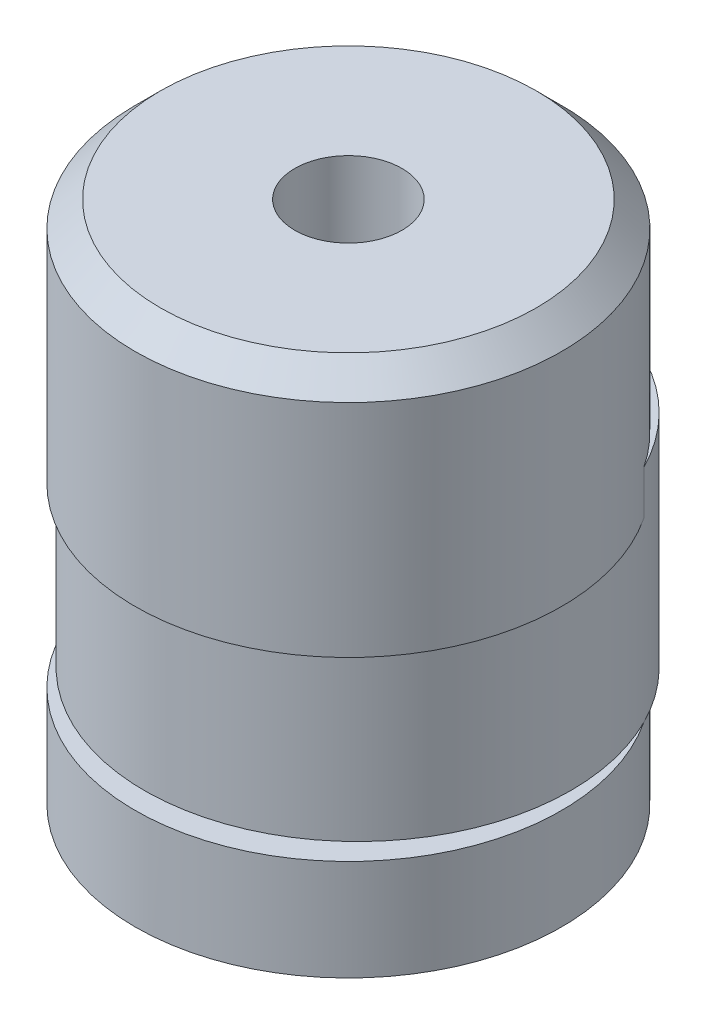
ISO-10303-21;
HEADER;
FILE_DESCRIPTION(('STEP AP214'),'2;1');
FILE_NAME('part.step','',(''),(''),'','','');
FILE_SCHEMA(('AUTOMOTIVE_DESIGN { 1 0 10303 214 1 1 1 1 }'));
ENDSEC;
DATA;
#1=APPLICATION_CONTEXT('core data for automotive mechanical design processes');
#2=APPLICATION_PROTOCOL_DEFINITION('international standard','automotive_design',2000,#1);
#3=PRODUCT_CONTEXT('',#1,'mechanical');
#4=PRODUCT('Part','Part','',(#3));
#5=PRODUCT_RELATED_PRODUCT_CATEGORY('part','',(#4));
#6=PRODUCT_DEFINITION_FORMATION('','',#4);
#7=PRODUCT_DEFINITION_CONTEXT('part definition',#1,'design');
#8=PRODUCT_DEFINITION('design','',#6,#7);
#9=PRODUCT_DEFINITION_SHAPE('','',#8);
#10=(LENGTH_UNIT() NAMED_UNIT(*) SI_UNIT(.MILLI.,.METRE.));
#11=(NAMED_UNIT(*) PLANE_ANGLE_UNIT() SI_UNIT($,.RADIAN.));
#12=(NAMED_UNIT(*) SI_UNIT($,.STERADIAN.) SOLID_ANGLE_UNIT());
#13=UNCERTAINTY_MEASURE_WITH_UNIT(LENGTH_MEASURE(1.E-05),#10,'distance_accuracy_value','');
#14=(GEOMETRIC_REPRESENTATION_CONTEXT(3) GLOBAL_UNCERTAINTY_ASSIGNED_CONTEXT((#13)) GLOBAL_UNIT_ASSIGNED_CONTEXT((#10,
#11,#12)) REPRESENTATION_CONTEXT('',''));
#15=CARTESIAN_POINT('',(0.,0.,0.));
#16=DIRECTION('',(0.,0.,1.));
#17=DIRECTION('',(1.,0.,0.));
#18=AXIS2_PLACEMENT_3D('',#15,#16,#17);
#19=CARTESIAN_POINT('',(7.05509240187964,18.,-14.01));
#20=DIRECTION('',(0.,1.,0.));
#21=DIRECTION('',(0.,0.,1.));
#22=AXIS2_PLACEMENT_3D('',#19,#20,#21);
#23=PLANE('',#22);
#24=CARTESIAN_POINT('',(0.,18.,0.));
#25=DIRECTION('',(0.,1.,0.));
#26=DIRECTION('',(0.,0.,1.));
#27=AXIS2_PLACEMENT_3D('',#24,#25,#26);
#28=CIRCLE('',#27,8.45);
#29=CARTESIAN_POINT('',(0.,18.,8.45));
#30=VERTEX_POINT('',#29);
#31=EDGE_CURVE('E107',#30,#30,#28,.T.);
#32=ORIENTED_EDGE('',*,*,#31,.F.);
#33=EDGE_LOOP('',(#32));
#34=FACE_BOUND('',#33,.T.);
#35=CARTESIAN_POINT('',(0.,18.,5.));
#36=DIRECTION('',(0.,1.,0.));
#37=DIRECTION('',(0.,0.,1.));
#38=AXIS2_PLACEMENT_3D('',#35,#36,#37);
#39=CIRCLE('',#38,2.1);
#40=CARTESIAN_POINT('',(0.,18.,7.1));
#41=VERTEX_POINT('',#40);
#42=EDGE_CURVE('E55',#41,#41,#39,.T.);
#43=ORIENTED_EDGE('',*,*,#42,.T.);
#44=EDGE_LOOP('',(#43));
#45=FACE_BOUND('',#44,.T.);
#46=CARTESIAN_POINT('',(-5.,18.,0.));
#47=DIRECTION('',(0.,1.,0.));
#48=DIRECTION('',(0.,0.,1.));
#49=AXIS2_PLACEMENT_3D('',#46,#47,#48);
#50=CIRCLE('',#49,2.1);
#51=CARTESIAN_POINT('',(-5.,18.,2.1));
#52=VERTEX_POINT('',#51);
#53=EDGE_CURVE('E150',#52,#52,#50,.T.);
#54=ORIENTED_EDGE('',*,*,#53,.T.);
#55=EDGE_LOOP('',(#54));
#56=FACE_BOUND('',#55,.T.);
#57=CARTESIAN_POINT('',(0.,18.,0.));
#58=DIRECTION('',(0.,1.,0.));
#59=DIRECTION('',(0.,0.,1.));
#60=AXIS2_PLACEMENT_3D('',#57,#58,#59);
#61=CIRCLE('',#60,2.125);
#62=CARTESIAN_POINT('',(0.,18.,2.125));
#63=VERTEX_POINT('',#62);
#64=EDGE_CURVE('E147',#63,#63,#61,.F.);
#65=ORIENTED_EDGE('',*,*,#64,.F.);
#66=EDGE_LOOP('',(#65));
#67=FACE_BOUND('',#66,.T.);
#68=CARTESIAN_POINT('',(5.,18.,0.));
#69=DIRECTION('',(0.,-1.,0.));
#70=DIRECTION('',(0.,0.,-1.));
#71=AXIS2_PLACEMENT_3D('',#68,#69,#70);
#72=CIRCLE('',#71,2.1);
#73=CARTESIAN_POINT('',(5.,18.,-2.1));
#74=VERTEX_POINT('',#73);
#75=EDGE_CURVE('E142',#74,#74,#72,.T.);
#76=ORIENTED_EDGE('',*,*,#75,.F.);
#77=EDGE_LOOP('',(#76));
#78=FACE_BOUND('',#77,.T.);
#79=ADVANCED_FACE('F51',(#34,#45,#56,#67,#78),#23,.F.);
#80=CARTESIAN_POINT('',(0.,31.5,5.));
#81=DIRECTION('',(0.,-1.,0.));
#82=DIRECTION('',(0.,0.,-1.));
#83=AXIS2_PLACEMENT_3D('',#80,#81,#82);
#84=CYLINDRICAL_SURFACE('',#83,2.1);
#85=ORIENTED_EDGE('',*,*,#42,.F.);
#86=EDGE_LOOP('',(#85));
#87=FACE_BOUND('',#86,.T.);
#88=CARTESIAN_POINT('',(0.,31.5,5.));
#89=DIRECTION('',(0.,1.,0.));
#90=DIRECTION('',(0.,0.,1.));
#91=AXIS2_PLACEMENT_3D('',#88,#89,#90);
#92=CIRCLE('',#91,2.1);
#93=CARTESIAN_POINT('',(0.,31.5,7.1));
#94=VERTEX_POINT('',#93);
#95=EDGE_CURVE('E11',#94,#94,#92,.T.);
#96=ORIENTED_EDGE('',*,*,#95,.T.);
#97=EDGE_LOOP('',(#96));
#98=FACE_BOUND('',#97,.T.);
#99=ADVANCED_FACE('F162',(#87,#98),#84,.F.);
#100=CARTESIAN_POINT('',(0.,31.5,5.));
#101=DIRECTION('',(0.,1.,0.));
#102=DIRECTION('',(0.,0.,1.));
#103=AXIS2_PLACEMENT_3D('',#100,#101,#102);
#104=PLANE('',#103);
#105=ORIENTED_EDGE('',*,*,#95,.F.);
#106=EDGE_LOOP('',(#105));
#107=FACE_BOUND('',#106,.T.);
#108=ADVANCED_FACE('F165',(#107),#104,.F.);
#109=CARTESIAN_POINT('',(-5.,31.5,0.));
#110=DIRECTION('',(0.,-1.,0.));
#111=DIRECTION('',(0.,0.,-1.));
#112=AXIS2_PLACEMENT_3D('',#109,#110,#111);
#113=CYLINDRICAL_SURFACE('',#112,2.1);
#114=ORIENTED_EDGE('',*,*,#53,.F.);
#115=EDGE_LOOP('',(#114));
#116=FACE_BOUND('',#115,.T.);
#117=CARTESIAN_POINT('',(-5.,31.5,0.));
#118=DIRECTION('',(0.,1.,0.));
#119=DIRECTION('',(0.,0.,1.));
#120=AXIS2_PLACEMENT_3D('',#117,#118,#119);
#121=CIRCLE('',#120,2.1);
#122=CARTESIAN_POINT('',(-5.,31.5,2.1));
#123=VERTEX_POINT('',#122);
#124=EDGE_CURVE('E61',#123,#123,#121,.T.);
#125=ORIENTED_EDGE('',*,*,#124,.T.);
#126=EDGE_LOOP('',(#125));
#127=FACE_BOUND('',#126,.T.);
#128=ADVANCED_FACE('F170',(#116,#127),#113,.F.);
#129=CARTESIAN_POINT('',(-5.,31.5,0.));
#130=DIRECTION('',(0.,1.,0.));
#131=DIRECTION('',(0.,0.,1.));
#132=AXIS2_PLACEMENT_3D('',#129,#130,#131);
#133=PLANE('',#132);
#134=ORIENTED_EDGE('',*,*,#124,.F.);
#135=EDGE_LOOP('',(#134));
#136=FACE_BOUND('',#135,.T.);
#137=ADVANCED_FACE('F174',(#136),#133,.F.);
#138=CARTESIAN_POINT('',(5.,31.5,0.));
#139=DIRECTION('',(0.,-1.,0.));
#140=DIRECTION('',(0.,0.,-1.));
#141=AXIS2_PLACEMENT_3D('',#138,#139,#140);
#142=CYLINDRICAL_SURFACE('',#141,2.1);
#143=ORIENTED_EDGE('',*,*,#75,.T.);
#144=EDGE_LOOP('',(#143));
#145=FACE_BOUND('',#144,.T.);
#146=CARTESIAN_POINT('',(5.,31.5,0.));
#147=DIRECTION('',(0.,1.,0.));
#148=DIRECTION('',(0.,0.,1.));
#149=AXIS2_PLACEMENT_3D('',#146,#147,#148);
#150=CIRCLE('',#149,2.1);
#151=CARTESIAN_POINT('',(5.,31.5,2.1));
#152=VERTEX_POINT('',#151);
#153=EDGE_CURVE('E134',#152,#152,#150,.T.);
#154=ORIENTED_EDGE('',*,*,#153,.T.);
#155=EDGE_LOOP('',(#154));
#156=FACE_BOUND('',#155,.T.);
#157=ADVANCED_FACE('F227',(#145,#156),#142,.F.);
#158=CARTESIAN_POINT('',(5.,31.5,0.));
#159=DIRECTION('',(0.,1.,0.));
#160=DIRECTION('',(0.,0.,1.));
#161=AXIS2_PLACEMENT_3D('',#158,#159,#160);
#162=PLANE('',#161);
#163=ORIENTED_EDGE('',*,*,#153,.F.);
#164=EDGE_LOOP('',(#163));
#165=FACE_BOUND('',#164,.T.);
#166=ADVANCED_FACE('F224',(#165),#162,.F.);
#167=CARTESIAN_POINT('',(0.,29.,0.));
#168=DIRECTION('',(0.,1.,0.));
#169=DIRECTION('',(0.,0.,1.));
#170=AXIS2_PLACEMENT_3D('',#167,#168,#169);
#171=PLANE('',#170);
#172=CARTESIAN_POINT('',(0.,29.,0.));
#173=DIRECTION('',(0.,1.,0.));
#174=DIRECTION('',(0.,0.,1.));
#175=AXIS2_PLACEMENT_3D('',#172,#173,#174);
#176=CIRCLE('',#175,8.45);
#177=CARTESIAN_POINT('',(-7.55509240187965,29.,3.78458436278813));
#178=VERTEX_POINT('',#177);
#179=CARTESIAN_POINT('',(7.05509240187964,29.,-4.65060976657257));
#180=VERTEX_POINT('',#179);
#181=EDGE_CURVE('E91',#178,#180,#176,.T.);
#182=ORIENTED_EDGE('',*,*,#181,.F.);
#183=CARTESIAN_POINT('',(-0.500000000000004,29.,-0.866025403784436));
#184=DIRECTION('',(0.,1.,0.));
#185=DIRECTION('',(0.,0.,1.));
#186=AXIS2_PLACEMENT_3D('',#183,#184,#185);
#187=CIRCLE('',#186,8.45);
#188=EDGE_CURVE('E68',#178,#180,#187,.T.);
#189=ORIENTED_EDGE('',*,*,#188,.T.);
#190=EDGE_LOOP('',(#182,#189));
#191=FACE_BOUND('',#190,.T.);
#192=ADVANCED_FACE('F216',(#191),#171,.F.);
#193=CARTESIAN_POINT('',(-0.500000000000004,30.75,-0.866025403784436));
#194=DIRECTION('',(0.,1.,0.));
#195=DIRECTION('',(0.,0.,1.));
#196=AXIS2_PLACEMENT_3D('',#193,#194,#195);
#197=PLANE('',#196);
#198=CARTESIAN_POINT('',(-0.500000000000004,30.75,-0.866025403784436));
#199=DIRECTION('',(0.,1.,0.));
#200=DIRECTION('',(0.,0.,1.));
#201=AXIS2_PLACEMENT_3D('',#198,#199,#200);
#202=CIRCLE('',#201,8.45);
#203=CARTESIAN_POINT('',(7.05509240187964,30.75,-4.65060976657257));
#204=VERTEX_POINT('',#203);
#205=CARTESIAN_POINT('',(-7.55509240187964,30.75,3.78458436278813));
#206=VERTEX_POINT('',#205);
#207=EDGE_CURVE('E99',#204,#206,#202,.T.);
#208=ORIENTED_EDGE('',*,*,#207,.T.);
#209=CARTESIAN_POINT('',(0.,30.75,0.));
#210=DIRECTION('',(0.,1.,0.));
#211=DIRECTION('',(0.,0.,1.));
#212=AXIS2_PLACEMENT_3D('',#209,#210,#211);
#213=CIRCLE('',#212,8.45);
#214=EDGE_CURVE('E90',#206,#204,#213,.F.);
#215=ORIENTED_EDGE('',*,*,#214,.T.);
#216=EDGE_LOOP('',(#208,#215));
#217=FACE_BOUND('',#216,.T.);
#218=ADVANCED_FACE('F98',(#217),#197,.T.);
#219=CARTESIAN_POINT('',(0.,38.75,0.));
#220=DIRECTION('',(0.,-1.,0.));
#221=DIRECTION('',(0.,0.,-1.));
#222=AXIS2_PLACEMENT_3D('',#219,#220,#221);
#223=CYLINDRICAL_SURFACE('',#222,8.45);
#224=CARTESIAN_POINT('',(0.,37.75,0.));
#225=DIRECTION('',(0.,1.,0.));
#226=DIRECTION('',(0.,0.,1.));
#227=AXIS2_PLACEMENT_3D('',#224,#225,#226);
#228=CIRCLE('',#227,8.45);
#229=CARTESIAN_POINT('',(0.,37.75,8.45));
#230=VERTEX_POINT('',#229);
#231=EDGE_CURVE('E146',#230,#230,#228,.F.);
#232=ORIENTED_EDGE('',*,*,#231,.T.);
#233=EDGE_LOOP('',(#232));
#234=FACE_BOUND('',#233,.T.);
#235=ORIENTED_EDGE('',*,*,#214,.F.);
#236=DIRECTION('',(0.,-1.,0.));
#237=VECTOR('',#236,1.);
#238=CARTESIAN_POINT('',(-7.55509240187964,29.875,3.78458436278813));
#239=LINE('',#238,#237);
#240=EDGE_CURVE('E75',#206,#178,#239,.T.);
#241=ORIENTED_EDGE('',*,*,#240,.T.);
#242=ORIENTED_EDGE('',*,*,#181,.T.);
#243=DIRECTION('',(0.,-1.,0.));
#244=VECTOR('',#243,1.);
#245=CARTESIAN_POINT('',(7.05509240187964,29.875,-4.65060976657257));
#246=LINE('',#245,#244);
#247=EDGE_CURVE('E87',#180,#204,#246,.F.);
#248=ORIENTED_EDGE('',*,*,#247,.T.);
#249=EDGE_LOOP('',(#235,#241,#242,#248));
#250=FACE_BOUND('',#249,.T.);
#251=ADVANCED_FACE('F89',(#234,#250),#223,.T.);
#252=CARTESIAN_POINT('',(0.,38.75,0.));
#253=DIRECTION('',(0.,-1.,0.));
#254=DIRECTION('',(0.,0.,-1.));
#255=AXIS2_PLACEMENT_3D('',#252,#253,#254);
#256=CONICAL_SURFACE('',#255,7.44999999999999,0.785398163397445);
#257=ORIENTED_EDGE('',*,*,#231,.F.);
#258=EDGE_LOOP('',(#257));
#259=FACE_BOUND('',#258,.T.);
#260=CARTESIAN_POINT('',(0.,38.75,0.));
#261=DIRECTION('',(0.,1.,0.));
#262=DIRECTION('',(0.,0.,1.));
#263=AXIS2_PLACEMENT_3D('',#260,#261,#262);
#264=CIRCLE('',#263,7.44999999999999);
#265=CARTESIAN_POINT('',(0.,38.75,7.44999999999999));
#266=VERTEX_POINT('',#265);
#267=EDGE_CURVE('E102',#266,#266,#264,.T.);
#268=ORIENTED_EDGE('',*,*,#267,.F.);
#269=EDGE_LOOP('',(#268));
#270=FACE_BOUND('',#269,.T.);
#271=ADVANCED_FACE('F213',(#259,#270),#256,.T.);
#272=CARTESIAN_POINT('',(0.,38.75,0.));
#273=DIRECTION('',(0.,1.,0.));
#274=DIRECTION('',(0.,0.,1.));
#275=AXIS2_PLACEMENT_3D('',#272,#273,#274);
#276=PLANE('',#275);
#277=ORIENTED_EDGE('',*,*,#267,.T.);
#278=EDGE_LOOP('',(#277));
#279=FACE_BOUND('',#278,.T.);
#280=CARTESIAN_POINT('',(0.,38.75,0.));
#281=DIRECTION('',(0.,1.,0.));
#282=DIRECTION('',(0.,0.,1.));
#283=AXIS2_PLACEMENT_3D('',#280,#281,#282);
#284=CIRCLE('',#283,2.125);
#285=CARTESIAN_POINT('',(0.,38.75,2.125));
#286=VERTEX_POINT('',#285);
#287=EDGE_CURVE('E130',#286,#286,#284,.T.);
#288=ORIENTED_EDGE('',*,*,#287,.F.);
#289=EDGE_LOOP('',(#288));
#290=FACE_BOUND('',#289,.T.);
#291=ADVANCED_FACE('F209',(#279,#290),#276,.T.);
#292=CARTESIAN_POINT('',(0.,30.75,0.));
#293=DIRECTION('',(0.,-1.,0.));
#294=DIRECTION('',(0.,0.,-1.));
#295=AXIS2_PLACEMENT_3D('',#292,#293,#294);
#296=CYLINDRICAL_SURFACE('',#295,2.125);
#297=ORIENTED_EDGE('',*,*,#64,.T.);
#298=EDGE_LOOP('',(#297));
#299=FACE_BOUND('',#298,.T.);
#300=ORIENTED_EDGE('',*,*,#287,.T.);
#301=EDGE_LOOP('',(#300));
#302=FACE_BOUND('',#301,.T.);
#303=ADVANCED_FACE('F203',(#299,#302),#296,.F.);
#304=CARTESIAN_POINT('',(-0.500000000000004,30.75,-0.866025403784436));
#305=DIRECTION('',(0.,-1.,0.));
#306=DIRECTION('',(0.,0.,-1.));
#307=AXIS2_PLACEMENT_3D('',#304,#305,#306);
#308=CYLINDRICAL_SURFACE('',#307,8.45);
#309=CARTESIAN_POINT('',(-0.500000000000004,22.,-0.866025403784436));
#310=DIRECTION('',(0.,1.,0.));
#311=DIRECTION('',(0.,0.,1.));
#312=AXIS2_PLACEMENT_3D('',#309,#310,#311);
#313=CIRCLE('',#312,8.45);
#314=CARTESIAN_POINT('',(-7.55509240187964,22.,3.78458436278813));
#315=VERTEX_POINT('',#314);
#316=CARTESIAN_POINT('',(7.05509240187964,22.,-4.65060976657257));
#317=VERTEX_POINT('',#316);
#318=EDGE_CURVE('E122',#315,#317,#313,.T.);
#319=ORIENTED_EDGE('',*,*,#318,.T.);
#320=CARTESIAN_POINT('',(-0.500000000000004,22.,-0.866025403784436));
#321=DIRECTION('',(0.,1.,0.));
#322=DIRECTION('',(0.,0.,1.));
#323=AXIS2_PLACEMENT_3D('',#320,#321,#322);
#324=CIRCLE('',#323,8.45);
#325=EDGE_CURVE('E106',#317,#315,#324,.T.);
#326=ORIENTED_EDGE('',*,*,#325,.T.);
#327=EDGE_LOOP('',(#319,#326));
#328=FACE_BOUND('',#327,.T.);
#329=ORIENTED_EDGE('',*,*,#240,.F.);
#330=ORIENTED_EDGE('',*,*,#207,.F.);
#331=ORIENTED_EDGE('',*,*,#247,.F.);
#332=ORIENTED_EDGE('',*,*,#188,.F.);
#333=EDGE_LOOP('',(#329,#330,#331,#332));
#334=FACE_BOUND('',#333,.T.);
#335=ADVANCED_FACE('F104',(#328,#334),#308,.T.);
#336=CARTESIAN_POINT('',(-0.500000000000004,22.,-0.866025403784436));
#337=DIRECTION('',(0.,1.,0.));
#338=DIRECTION('',(0.,0.,1.));
#339=AXIS2_PLACEMENT_3D('',#336,#337,#338);
#340=PLANE('',#339);
#341=ORIENTED_EDGE('',*,*,#325,.F.);
#342=CARTESIAN_POINT('',(0.,22.,0.));
#343=DIRECTION('',(0.,1.,0.));
#344=DIRECTION('',(0.,0.,1.));
#345=AXIS2_PLACEMENT_3D('',#342,#343,#344);
#346=CIRCLE('',#345,8.45);
#347=EDGE_CURVE('E101',#317,#315,#346,.T.);
#348=ORIENTED_EDGE('',*,*,#347,.T.);
#349=EDGE_LOOP('',(#341,#348));
#350=FACE_BOUND('',#349,.T.);
#351=ADVANCED_FACE('F190',(#350),#340,.F.);
#352=CARTESIAN_POINT('',(0.249999999999999,22.,0.));
#353=DIRECTION('',(0.,1.,0.));
#354=DIRECTION('',(0.,0.,1.));
#355=AXIS2_PLACEMENT_3D('',#352,#353,#354);
#356=PLANE('',#355);
#357=CARTESIAN_POINT('',(0.,22.,0.));
#358=DIRECTION('',(0.,1.,0.));
#359=DIRECTION('',(0.,0.,1.));
#360=AXIS2_PLACEMENT_3D('',#357,#358,#359);
#361=CIRCLE('',#360,8.45);
#362=EDGE_CURVE('E114',#315,#317,#361,.T.);
#363=ORIENTED_EDGE('',*,*,#362,.T.);
#364=ORIENTED_EDGE('',*,*,#318,.F.);
#365=EDGE_LOOP('',(#363,#364));
#366=FACE_BOUND('',#365,.T.);
#367=ADVANCED_FACE('F186',(#366),#356,.T.);
#368=CARTESIAN_POINT('',(0.,29.,0.));
#369=DIRECTION('',(0.,-1.,0.));
#370=DIRECTION('',(0.,0.,-1.));
#371=AXIS2_PLACEMENT_3D('',#368,#369,#370);
#372=CYLINDRICAL_SURFACE('',#371,8.45);
#373=ORIENTED_EDGE('',*,*,#31,.T.);
#374=EDGE_LOOP('',(#373));
#375=FACE_BOUND('',#374,.T.);
#376=ORIENTED_EDGE('',*,*,#362,.F.);
#377=ORIENTED_EDGE('',*,*,#347,.F.);
#378=EDGE_LOOP('',(#376,#377));
#379=FACE_BOUND('',#378,.T.);
#380=ADVANCED_FACE('F53',(#375,#379),#372,.T.);
#381=CLOSED_SHELL('',(#79,#99,#108,#128,#137,#157,#166,#192,#218,#251,#271,#291,#303,#335,#351,
#367,#380));
#382=MANIFOLD_SOLID_BREP('B2',#381);
#383=ADVANCED_BREP_SHAPE_REPRESENTATION('',(#18,#382),#14);
#384=SHAPE_DEFINITION_REPRESENTATION(#9,#383);
ENDSEC;
END-ISO-10303-21;
